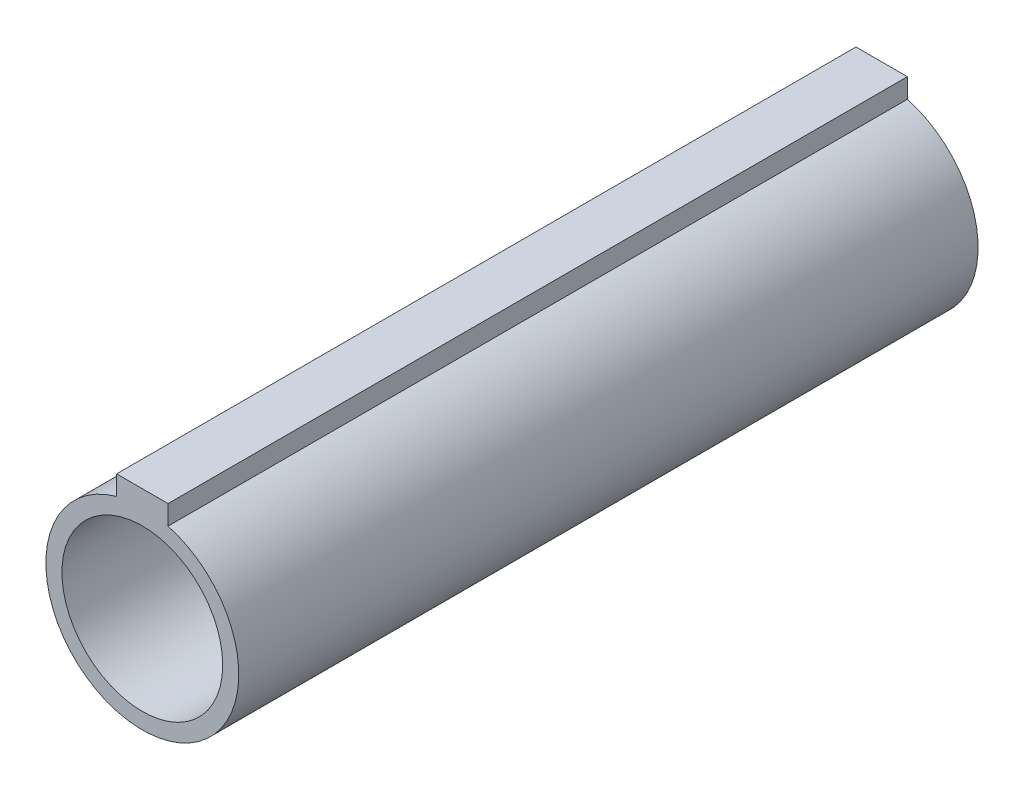
ISO-10303-21;
HEADER;
FILE_DESCRIPTION(('STEP AP214'),'2;1');
FILE_NAME('part.step','',(''),(''),'','','');
FILE_SCHEMA(('AUTOMOTIVE_DESIGN { 1 0 10303 214 1 1 1 1 }'));
ENDSEC;
DATA;
#1=APPLICATION_CONTEXT('core data for automotive mechanical design processes');
#2=APPLICATION_PROTOCOL_DEFINITION('international standard','automotive_design',2000,#1);
#3=PRODUCT_CONTEXT('',#1,'mechanical');
#4=PRODUCT('Part','Part','',(#3));
#5=PRODUCT_RELATED_PRODUCT_CATEGORY('part','',(#4));
#6=PRODUCT_DEFINITION_FORMATION('','',#4);
#7=PRODUCT_DEFINITION_CONTEXT('part definition',#1,'design');
#8=PRODUCT_DEFINITION('design','',#6,#7);
#9=PRODUCT_DEFINITION_SHAPE('','',#8);
#10=(LENGTH_UNIT() NAMED_UNIT(*) SI_UNIT(.MILLI.,.METRE.));
#11=(NAMED_UNIT(*) PLANE_ANGLE_UNIT() SI_UNIT($,.RADIAN.));
#12=(NAMED_UNIT(*) SI_UNIT($,.STERADIAN.) SOLID_ANGLE_UNIT());
#13=UNCERTAINTY_MEASURE_WITH_UNIT(LENGTH_MEASURE(1.E-05),#10,'distance_accuracy_value','');
#14=(GEOMETRIC_REPRESENTATION_CONTEXT(3) GLOBAL_UNCERTAINTY_ASSIGNED_CONTEXT((#13)) GLOBAL_UNIT_ASSIGNED_CONTEXT((#10,
#11,#12)) REPRESENTATION_CONTEXT('',''));
#15=CARTESIAN_POINT('',(0.,0.,0.));
#16=DIRECTION('',(0.,0.,1.));
#17=DIRECTION('',(1.,0.,0.));
#18=AXIS2_PLACEMENT_3D('',#15,#16,#17);
#19=CARTESIAN_POINT('',(0.,0.,115.));
#20=DIRECTION('',(0.,0.,-1.));
#21=DIRECTION('',(-1.,0.,0.));
#22=AXIS2_PLACEMENT_3D('',#19,#20,#21);
#23=CYLINDRICAL_SURFACE('',#22,15.);
#24=DIRECTION('',(0.,0.,-1.));
#25=VECTOR('',#24,1.);
#26=CARTESIAN_POINT('',(-4.,14.456832294801,115.));
#27=LINE('',#26,#25);
#28=CARTESIAN_POINT('',(-4.,14.456832294801,0.));
#29=VERTEX_POINT('',#28);
#30=CARTESIAN_POINT('',(-4.,14.456832294801,115.));
#31=VERTEX_POINT('',#30);
#32=EDGE_CURVE('E112',#29,#31,#27,.F.);
#33=ORIENTED_EDGE('',*,*,#32,.F.);
#34=CARTESIAN_POINT('',(0.,0.,0.));
#35=DIRECTION('',(0.,0.,1.));
#36=DIRECTION('',(1.,0.,0.));
#37=AXIS2_PLACEMENT_3D('',#34,#35,#36);
#38=CIRCLE('',#37,15.);
#39=CARTESIAN_POINT('',(4.,14.456832294801,0.));
#40=VERTEX_POINT('',#39);
#41=EDGE_CURVE('E43',#29,#40,#38,.T.);
#42=ORIENTED_EDGE('',*,*,#41,.T.);
#43=DIRECTION('',(0.,0.,-1.));
#44=VECTOR('',#43,1.);
#45=CARTESIAN_POINT('',(4.,14.456832294801,115.));
#46=LINE('',#45,#44);
#47=CARTESIAN_POINT('',(4.,14.456832294801,115.));
#48=VERTEX_POINT('',#47);
#49=EDGE_CURVE('E59',#48,#40,#46,.T.);
#50=ORIENTED_EDGE('',*,*,#49,.F.);
#51=CARTESIAN_POINT('',(0.,0.,115.));
#52=DIRECTION('',(0.,0.,1.));
#53=DIRECTION('',(1.,0.,0.));
#54=AXIS2_PLACEMENT_3D('',#51,#52,#53);
#55=CIRCLE('',#54,15.);
#56=EDGE_CURVE('E11',#31,#48,#55,.T.);
#57=ORIENTED_EDGE('',*,*,#56,.F.);
#58=EDGE_LOOP('',(#33,#42,#50,#57));
#59=FACE_BOUND('',#58,.T.);
#60=ADVANCED_FACE('F39',(#59),#23,.T.);
#61=CARTESIAN_POINT('',(0.,0.,115.));
#62=DIRECTION('',(0.,0.,-1.));
#63=DIRECTION('',(-1.,0.,0.));
#64=AXIS2_PLACEMENT_3D('',#61,#62,#63);
#65=CYLINDRICAL_SURFACE('',#64,12.5);
#66=CARTESIAN_POINT('',(0.,0.,0.));
#67=DIRECTION('',(0.,0.,1.));
#68=DIRECTION('',(1.,0.,0.));
#69=AXIS2_PLACEMENT_3D('',#66,#67,#68);
#70=CIRCLE('',#69,12.5);
#71=CARTESIAN_POINT('',(12.5,0.,0.));
#72=VERTEX_POINT('',#71);
#73=EDGE_CURVE('E114',#72,#72,#70,.T.);
#74=ORIENTED_EDGE('',*,*,#73,.F.);
#75=EDGE_LOOP('',(#74));
#76=FACE_BOUND('',#75,.T.);
#77=CARTESIAN_POINT('',(0.,0.,115.));
#78=DIRECTION('',(0.,0.,1.));
#79=DIRECTION('',(1.,0.,0.));
#80=AXIS2_PLACEMENT_3D('',#77,#78,#79);
#81=CIRCLE('',#80,12.5);
#82=CARTESIAN_POINT('',(12.5,0.,115.));
#83=VERTEX_POINT('',#82);
#84=EDGE_CURVE('E48',#83,#83,#81,.T.);
#85=ORIENTED_EDGE('',*,*,#84,.T.);
#86=EDGE_LOOP('',(#85));
#87=FACE_BOUND('',#86,.T.);
#88=ADVANCED_FACE('F41',(#76,#87),#65,.F.);
#89=CARTESIAN_POINT('',(0.,0.,115.));
#90=DIRECTION('',(0.,0.,1.));
#91=DIRECTION('',(1.,0.,0.));
#92=AXIS2_PLACEMENT_3D('',#89,#90,#91);
#93=PLANE('',#92);
#94=ORIENTED_EDGE('',*,*,#56,.T.);
#95=DIRECTION('',(0.,1.,0.));
#96=VECTOR('',#95,1.);
#97=CARTESIAN_POINT('',(4.,17.5,115.));
#98=LINE('',#97,#96);
#99=CARTESIAN_POINT('',(4.,17.5,115.));
#100=VERTEX_POINT('',#99);
#101=EDGE_CURVE('E78',#48,#100,#98,.T.);
#102=ORIENTED_EDGE('',*,*,#101,.T.);
#103=DIRECTION('',(-1.,0.,0.));
#104=VECTOR('',#103,1.);
#105=CARTESIAN_POINT('',(4.,17.5,115.));
#106=LINE('',#105,#104);
#107=CARTESIAN_POINT('',(-4.,17.5,115.));
#108=VERTEX_POINT('',#107);
#109=EDGE_CURVE('E84',#100,#108,#106,.T.);
#110=ORIENTED_EDGE('',*,*,#109,.T.);
#111=DIRECTION('',(0.,-1.,0.));
#112=VECTOR('',#111,1.);
#113=CARTESIAN_POINT('',(-4.,17.5,115.));
#114=LINE('',#113,#112);
#115=EDGE_CURVE('E87',#108,#31,#114,.T.);
#116=ORIENTED_EDGE('',*,*,#115,.T.);
#117=EDGE_LOOP('',(#94,#102,#110,#116));
#118=FACE_BOUND('',#117,.T.);
#119=ORIENTED_EDGE('',*,*,#84,.F.);
#120=EDGE_LOOP('',(#119));
#121=FACE_BOUND('',#120,.T.);
#122=ADVANCED_FACE('F80',(#118,#121),#93,.T.);
#123=CARTESIAN_POINT('',(0.,0.,0.));
#124=DIRECTION('',(0.,0.,1.));
#125=DIRECTION('',(1.,0.,0.));
#126=AXIS2_PLACEMENT_3D('',#123,#124,#125);
#127=PLANE('',#126);
#128=ORIENTED_EDGE('',*,*,#41,.F.);
#129=DIRECTION('',(0.,-1.,0.));
#130=VECTOR('',#129,1.);
#131=CARTESIAN_POINT('',(-4.,17.5,0.));
#132=LINE('',#131,#130);
#133=CARTESIAN_POINT('',(-4.,17.5,0.));
#134=VERTEX_POINT('',#133);
#135=EDGE_CURVE('E105',#134,#29,#132,.T.);
#136=ORIENTED_EDGE('',*,*,#135,.F.);
#137=DIRECTION('',(-1.,0.,0.));
#138=VECTOR('',#137,1.);
#139=CARTESIAN_POINT('',(4.,17.5,0.));
#140=LINE('',#139,#138);
#141=CARTESIAN_POINT('',(4.,17.5,0.));
#142=VERTEX_POINT('',#141);
#143=EDGE_CURVE('E109',#142,#134,#140,.T.);
#144=ORIENTED_EDGE('',*,*,#143,.F.);
#145=DIRECTION('',(0.,1.,0.));
#146=VECTOR('',#145,1.);
#147=CARTESIAN_POINT('',(4.,17.5,0.));
#148=LINE('',#147,#146);
#149=EDGE_CURVE('E93',#40,#142,#148,.T.);
#150=ORIENTED_EDGE('',*,*,#149,.F.);
#151=EDGE_LOOP('',(#128,#136,#144,#150));
#152=FACE_BOUND('',#151,.T.);
#153=ORIENTED_EDGE('',*,*,#73,.T.);
#154=EDGE_LOOP('',(#153));
#155=FACE_BOUND('',#154,.T.);
#156=ADVANCED_FACE('F121',(#152,#155),#127,.F.);
#157=CARTESIAN_POINT('',(-4.,17.5,115.));
#158=DIRECTION('',(1.,0.,0.));
#159=DIRECTION('',(0.,1.,0.));
#160=AXIS2_PLACEMENT_3D('',#157,#158,#159);
#161=PLANE('',#160);
#162=ORIENTED_EDGE('',*,*,#135,.T.);
#163=ORIENTED_EDGE('',*,*,#32,.T.);
#164=ORIENTED_EDGE('',*,*,#115,.F.);
#165=DIRECTION('',(0.,0.,-1.));
#166=VECTOR('',#165,1.);
#167=CARTESIAN_POINT('',(-4.,17.5,115.));
#168=LINE('',#167,#166);
#169=EDGE_CURVE('E96',#108,#134,#168,.T.);
#170=ORIENTED_EDGE('',*,*,#169,.T.);
#171=EDGE_LOOP('',(#162,#163,#164,#170));
#172=FACE_BOUND('',#171,.T.);
#173=ADVANCED_FACE('F123',(#172),#161,.F.);
#174=CARTESIAN_POINT('',(4.,17.5,115.));
#175=DIRECTION('',(-1.,0.,0.));
#176=DIRECTION('',(0.,-1.,0.));
#177=AXIS2_PLACEMENT_3D('',#174,#175,#176);
#178=PLANE('',#177);
#179=ORIENTED_EDGE('',*,*,#101,.F.);
#180=ORIENTED_EDGE('',*,*,#49,.T.);
#181=ORIENTED_EDGE('',*,*,#149,.T.);
#182=DIRECTION('',(0.,0.,-1.));
#183=VECTOR('',#182,1.);
#184=CARTESIAN_POINT('',(4.,17.5,115.));
#185=LINE('',#184,#183);
#186=EDGE_CURVE('E90',#100,#142,#185,.T.);
#187=ORIENTED_EDGE('',*,*,#186,.F.);
#188=EDGE_LOOP('',(#179,#180,#181,#187));
#189=FACE_BOUND('',#188,.T.);
#190=ADVANCED_FACE('F91',(#189),#178,.F.);
#191=CARTESIAN_POINT('',(4.,17.5,115.));
#192=DIRECTION('',(0.,-1.,0.));
#193=DIRECTION('',(0.,0.,-1.));
#194=AXIS2_PLACEMENT_3D('',#191,#192,#193);
#195=PLANE('',#194);
#196=ORIENTED_EDGE('',*,*,#143,.T.);
#197=ORIENTED_EDGE('',*,*,#169,.F.);
#198=ORIENTED_EDGE('',*,*,#109,.F.);
#199=ORIENTED_EDGE('',*,*,#186,.T.);
#200=EDGE_LOOP('',(#196,#197,#198,#199));
#201=FACE_BOUND('',#200,.T.);
#202=ADVANCED_FACE('F98',(#201),#195,.F.);
#203=CLOSED_SHELL('',(#60,#88,#122,#156,#173,#190,#202));
#204=MANIFOLD_SOLID_BREP('B2',#203);
#205=ADVANCED_BREP_SHAPE_REPRESENTATION('',(#18,#204),#14);
#206=SHAPE_DEFINITION_REPRESENTATION(#9,#205);
ENDSEC;
END-ISO-10303-21;
